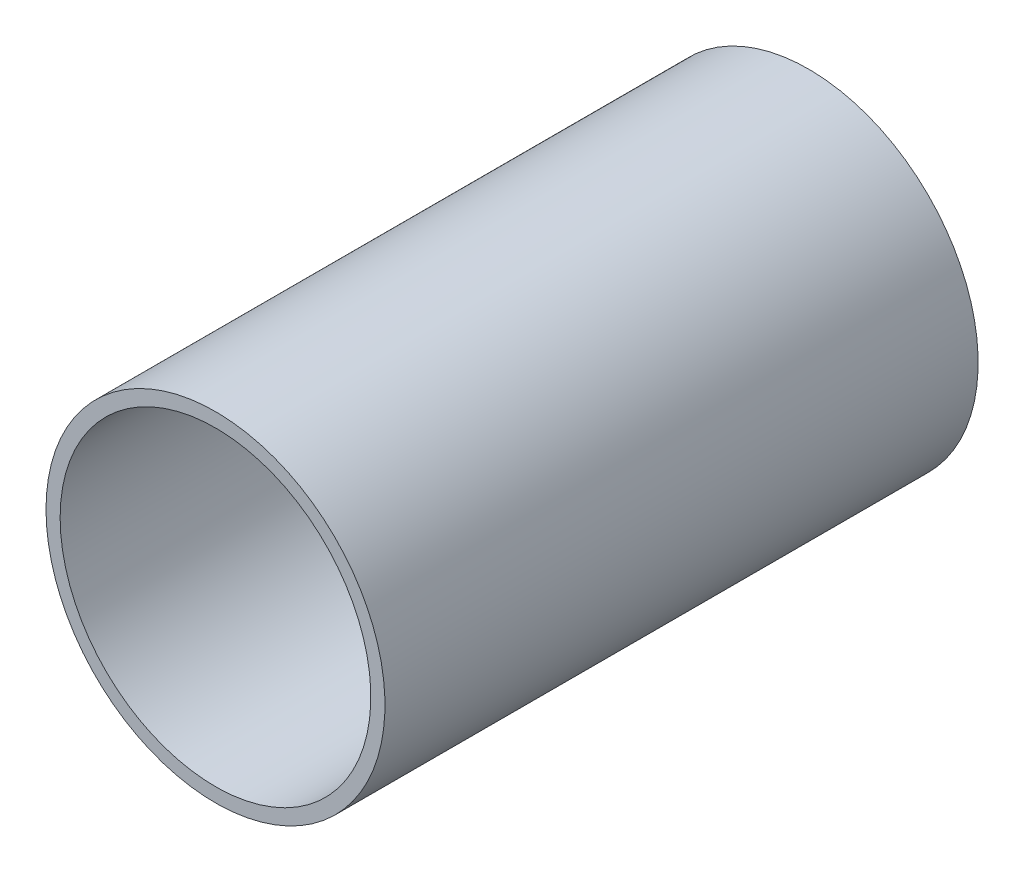
ISO-10303-21;
HEADER;
FILE_DESCRIPTION(('STEP AP214'),'2;1');
FILE_NAME('part.step','',(''),(''),'','','');
FILE_SCHEMA(('AUTOMOTIVE_DESIGN { 1 0 10303 214 1 1 1 1 }'));
ENDSEC;
DATA;
#1=APPLICATION_CONTEXT('core data for automotive mechanical design processes');
#2=APPLICATION_PROTOCOL_DEFINITION('international standard','automotive_design',2000,#1);
#3=PRODUCT_CONTEXT('',#1,'mechanical');
#4=PRODUCT('Part','Part','',(#3));
#5=PRODUCT_RELATED_PRODUCT_CATEGORY('part','',(#4));
#6=PRODUCT_DEFINITION_FORMATION('','',#4);
#7=PRODUCT_DEFINITION_CONTEXT('part definition',#1,'design');
#8=PRODUCT_DEFINITION('design','',#6,#7);
#9=PRODUCT_DEFINITION_SHAPE('','',#8);
#10=(LENGTH_UNIT() NAMED_UNIT(*) SI_UNIT(.MILLI.,.METRE.));
#11=(NAMED_UNIT(*) PLANE_ANGLE_UNIT() SI_UNIT($,.RADIAN.));
#12=(NAMED_UNIT(*) SI_UNIT($,.STERADIAN.) SOLID_ANGLE_UNIT());
#13=UNCERTAINTY_MEASURE_WITH_UNIT(LENGTH_MEASURE(1.E-05),#10,'distance_accuracy_value','');
#14=(GEOMETRIC_REPRESENTATION_CONTEXT(3) GLOBAL_UNCERTAINTY_ASSIGNED_CONTEXT((#13)) GLOBAL_UNIT_ASSIGNED_CONTEXT((#10,
#11,#12)) REPRESENTATION_CONTEXT('',''));
#15=CARTESIAN_POINT('',(0.,0.,0.));
#16=DIRECTION('',(0.,0.,1.));
#17=DIRECTION('',(1.,0.,0.));
#18=AXIS2_PLACEMENT_3D('',#15,#16,#17);
#19=CARTESIAN_POINT('',(0.,0.,21.));
#20=DIRECTION('',(0.,0.,1.));
#21=DIRECTION('',(1.,0.,0.));
#22=AXIS2_PLACEMENT_3D('',#19,#20,#21);
#23=PLANE('',#22);
#24=CARTESIAN_POINT('',(0.,0.,21.));
#25=DIRECTION('',(0.,0.,1.));
#26=DIRECTION('',(1.,0.,0.));
#27=AXIS2_PLACEMENT_3D('',#24,#25,#26);
#28=CIRCLE('',#27,12.);
#29=CARTESIAN_POINT('',(-12.,0.,21.));
#30=VERTEX_POINT('',#29);
#31=EDGE_CURVE('E10',#30,#30,#28,.T.);
#32=ORIENTED_EDGE('',*,*,#31,.T.);
#33=EDGE_LOOP('',(#32));
#34=FACE_BOUND('',#33,.T.);
#35=CARTESIAN_POINT('',(0.,0.,21.));
#36=DIRECTION('',(0.,0.,1.));
#37=DIRECTION('',(1.,0.,0.));
#38=AXIS2_PLACEMENT_3D('',#35,#36,#37);
#39=CIRCLE('',#38,11.);
#40=CARTESIAN_POINT('',(-11.,0.,21.));
#41=VERTEX_POINT('',#40);
#42=EDGE_CURVE('E42',#41,#41,#39,.T.);
#43=ORIENTED_EDGE('',*,*,#42,.F.);
#44=EDGE_LOOP('',(#43));
#45=FACE_BOUND('',#44,.T.);
#46=ADVANCED_FACE('F31',(#34,#45),#23,.T.);
#47=CARTESIAN_POINT('',(0.,0.,-21.));
#48=DIRECTION('',(0.,0.,1.));
#49=DIRECTION('',(1.,0.,0.));
#50=AXIS2_PLACEMENT_3D('',#47,#48,#49);
#51=PLANE('',#50);
#52=CARTESIAN_POINT('',(0.,0.,-21.));
#53=DIRECTION('',(0.,0.,1.));
#54=DIRECTION('',(1.,0.,0.));
#55=AXIS2_PLACEMENT_3D('',#52,#53,#54);
#56=CIRCLE('',#55,12.);
#57=CARTESIAN_POINT('',(-12.,0.,-21.));
#58=VERTEX_POINT('',#57);
#59=EDGE_CURVE('E35',#58,#58,#56,.T.);
#60=ORIENTED_EDGE('',*,*,#59,.F.);
#61=EDGE_LOOP('',(#60));
#62=FACE_BOUND('',#61,.T.);
#63=CARTESIAN_POINT('',(0.,0.,-21.));
#64=DIRECTION('',(0.,0.,1.));
#65=DIRECTION('',(1.,0.,0.));
#66=AXIS2_PLACEMENT_3D('',#63,#64,#65);
#67=CIRCLE('',#66,11.);
#68=CARTESIAN_POINT('',(-11.,0.,-21.));
#69=VERTEX_POINT('',#68);
#70=EDGE_CURVE('E44',#69,#69,#67,.T.);
#71=ORIENTED_EDGE('',*,*,#70,.T.);
#72=EDGE_LOOP('',(#71));
#73=FACE_BOUND('',#72,.T.);
#74=ADVANCED_FACE('F54',(#62,#73),#51,.F.);
#75=CARTESIAN_POINT('',(0.,0.,21.));
#76=DIRECTION('',(0.,0.,-1.));
#77=DIRECTION('',(-1.,0.,0.));
#78=AXIS2_PLACEMENT_3D('',#75,#76,#77);
#79=CYLINDRICAL_SURFACE('',#78,12.);
#80=CARTESIAN_POINT('',(-12.,0.,21.));
#81=CARTESIAN_POINT('',(-12.,0.,20.5625));
#82=CARTESIAN_POINT('',(-12.,0.,20.125));
#83=CARTESIAN_POINT('',(-12.,0.,19.25));
#84=CARTESIAN_POINT('',(-12.,0.,18.8125));
#85=CARTESIAN_POINT('',(-12.,0.,17.9375));
#86=CARTESIAN_POINT('',(-12.,0.,17.5));
#87=CARTESIAN_POINT('',(-12.,0.,16.625));
#88=CARTESIAN_POINT('',(-12.,0.,16.1875));
#89=CARTESIAN_POINT('',(-12.,0.,15.3125));
#90=CARTESIAN_POINT('',(-12.,0.,14.875));
#91=CARTESIAN_POINT('',(-12.,0.,14.));
#92=CARTESIAN_POINT('',(-12.,0.,13.5625));
#93=CARTESIAN_POINT('',(-12.,0.,12.6875));
#94=CARTESIAN_POINT('',(-12.,0.,12.25));
#95=CARTESIAN_POINT('',(-12.,0.,11.375));
#96=CARTESIAN_POINT('',(-12.,0.,10.9375));
#97=CARTESIAN_POINT('',(-12.,0.,10.0625));
#98=CARTESIAN_POINT('',(-12.,0.,9.625));
#99=CARTESIAN_POINT('',(-12.,0.,8.75));
#100=CARTESIAN_POINT('',(-12.,0.,8.3125));
#101=CARTESIAN_POINT('',(-12.,0.,7.4375));
#102=CARTESIAN_POINT('',(-12.,0.,7.));
#103=CARTESIAN_POINT('',(-12.,0.,6.125));
#104=CARTESIAN_POINT('',(-12.,0.,5.6875));
#105=CARTESIAN_POINT('',(-12.,0.,4.8125));
#106=CARTESIAN_POINT('',(-12.,0.,4.375));
#107=CARTESIAN_POINT('',(-12.,0.,3.5));
#108=CARTESIAN_POINT('',(-12.,0.,3.0625));
#109=CARTESIAN_POINT('',(-12.,0.,2.1875));
#110=CARTESIAN_POINT('',(-12.,0.,1.75));
#111=CARTESIAN_POINT('',(-12.,0.,0.874999999999997));
#112=CARTESIAN_POINT('',(-12.,0.,0.437499999999997));
#113=CARTESIAN_POINT('',(-12.,0.,-0.437500000000004));
#114=CARTESIAN_POINT('',(-12.,0.,-0.875000000000004));
#115=CARTESIAN_POINT('',(-12.,0.,-1.75000000000001));
#116=CARTESIAN_POINT('',(-12.,0.,-2.18750000000001));
#117=CARTESIAN_POINT('',(-12.,0.,-3.0625));
#118=CARTESIAN_POINT('',(-12.,0.,-3.5));
#119=CARTESIAN_POINT('',(-12.,0.,-4.375));
#120=CARTESIAN_POINT('',(-12.,0.,-4.8125));
#121=CARTESIAN_POINT('',(-12.,0.,-5.68750000000001));
#122=CARTESIAN_POINT('',(-12.,0.,-6.12500000000001));
#123=CARTESIAN_POINT('',(-12.,0.,-7.00000000000001));
#124=CARTESIAN_POINT('',(-12.,0.,-7.4375));
#125=CARTESIAN_POINT('',(-12.,0.,-8.3125));
#126=CARTESIAN_POINT('',(-12.,0.,-8.75));
#127=CARTESIAN_POINT('',(-12.,0.,-9.625));
#128=CARTESIAN_POINT('',(-12.,0.,-10.0625));
#129=CARTESIAN_POINT('',(-12.,0.,-10.9375));
#130=CARTESIAN_POINT('',(-12.,0.,-11.375));
#131=CARTESIAN_POINT('',(-12.,0.,-12.25));
#132=CARTESIAN_POINT('',(-12.,0.,-12.6875));
#133=CARTESIAN_POINT('',(-12.,0.,-13.5625));
#134=CARTESIAN_POINT('',(-12.,0.,-14.));
#135=CARTESIAN_POINT('',(-12.,0.,-14.875));
#136=CARTESIAN_POINT('',(-12.,0.,-15.3125));
#137=CARTESIAN_POINT('',(-12.,0.,-16.1875));
#138=CARTESIAN_POINT('',(-12.,0.,-16.625));
#139=CARTESIAN_POINT('',(-12.,0.,-17.5));
#140=CARTESIAN_POINT('',(-12.,0.,-17.9375));
#141=CARTESIAN_POINT('',(-12.,0.,-18.8125));
#142=CARTESIAN_POINT('',(-12.,0.,-19.25));
#143=CARTESIAN_POINT('',(-12.,0.,-20.125));
#144=CARTESIAN_POINT('',(-12.,0.,-20.5625));
#145=CARTESIAN_POINT('',(-12.,0.,-21.));
#146=B_SPLINE_CURVE_WITH_KNOTS('',3,(#80,#81,#82,#83,#84,#85,#86,#87,#88,#89,#90,#91,#92,#93,
#94,#95,#96,#97,#98,#99,#100,#101,#102,#103,#104,#105,#106,#107,#108,#109,#110,#111,#112,#113,
#114,#115,#116,#117,#118,#119,#120,#121,#122,#123,#124,#125,#126,#127,#128,#129,#130,#131,#132,
#133,#134,#135,#136,#137,#138,#139,#140,#141,#142,#143,#144,#145),.UNSPECIFIED.,.F.,.F.,(4,2,2,
2,2,2,2,2,2,2,2,2,2,2,2,2,2,2,2,2,2,2,2,2,2,2,2,2,2,2,2,2,4),(0.,1.3125,2.625,3.9375,5.25,
6.5625,7.875,9.1875,10.5,11.8125,13.125,14.4375,15.75,17.0625,18.375,19.6875,21.,22.3125,23.625,
24.9375,26.25,27.5625,28.875,30.1875,31.5,32.8125,34.125,35.4375,36.75,38.0625,39.375,40.6875,
42.),.UNSPECIFIED.);
#147=EDGE_CURVE('BSEAM33',#30,#58,#146,.T.);
#148=ORIENTED_EDGE('',*,*,#31,.F.);
#149=ORIENTED_EDGE('',*,*,#59,.T.);
#150=ORIENTED_EDGE('',*,*,#147,.T.);
#151=ORIENTED_EDGE('',*,*,#147,.F.);
#152=EDGE_LOOP('',(#148,#150,#149,#151));
#153=FACE_BOUND('',#152,.T.);
#154=ADVANCED_FACE('F33',(#153),#79,.T.);
#155=CARTESIAN_POINT('',(0.,0.,21.));
#156=DIRECTION('',(0.,0.,-1.));
#157=DIRECTION('',(-1.,0.,0.));
#158=AXIS2_PLACEMENT_3D('',#155,#156,#157);
#159=CYLINDRICAL_SURFACE('',#158,11.);
#160=CARTESIAN_POINT('',(-11.,0.,21.));
#161=CARTESIAN_POINT('',(-11.,0.,20.5625));
#162=CARTESIAN_POINT('',(-11.,0.,20.125));
#163=CARTESIAN_POINT('',(-11.,0.,19.25));
#164=CARTESIAN_POINT('',(-11.,0.,18.8125));
#165=CARTESIAN_POINT('',(-11.,0.,17.9375));
#166=CARTESIAN_POINT('',(-11.,0.,17.5));
#167=CARTESIAN_POINT('',(-11.,0.,16.625));
#168=CARTESIAN_POINT('',(-11.,0.,16.1875));
#169=CARTESIAN_POINT('',(-11.,0.,15.3125));
#170=CARTESIAN_POINT('',(-11.,0.,14.875));
#171=CARTESIAN_POINT('',(-11.,0.,14.));
#172=CARTESIAN_POINT('',(-11.,0.,13.5625));
#173=CARTESIAN_POINT('',(-11.,0.,12.6875));
#174=CARTESIAN_POINT('',(-11.,0.,12.25));
#175=CARTESIAN_POINT('',(-11.,0.,11.375));
#176=CARTESIAN_POINT('',(-11.,0.,10.9375));
#177=CARTESIAN_POINT('',(-11.,0.,10.0625));
#178=CARTESIAN_POINT('',(-11.,0.,9.625));
#179=CARTESIAN_POINT('',(-11.,0.,8.75));
#180=CARTESIAN_POINT('',(-11.,0.,8.3125));
#181=CARTESIAN_POINT('',(-11.,0.,7.4375));
#182=CARTESIAN_POINT('',(-11.,0.,7.));
#183=CARTESIAN_POINT('',(-11.,0.,6.125));
#184=CARTESIAN_POINT('',(-11.,0.,5.6875));
#185=CARTESIAN_POINT('',(-11.,0.,4.8125));
#186=CARTESIAN_POINT('',(-11.,0.,4.375));
#187=CARTESIAN_POINT('',(-11.,0.,3.5));
#188=CARTESIAN_POINT('',(-11.,0.,3.0625));
#189=CARTESIAN_POINT('',(-11.,0.,2.1875));
#190=CARTESIAN_POINT('',(-11.,0.,1.75));
#191=CARTESIAN_POINT('',(-11.,0.,0.875000000000001));
#192=CARTESIAN_POINT('',(-11.,0.,0.4375));
#193=CARTESIAN_POINT('',(-11.,0.,-0.4375));
#194=CARTESIAN_POINT('',(-11.,0.,-0.875000000000001));
#195=CARTESIAN_POINT('',(-11.,0.,-1.75));
#196=CARTESIAN_POINT('',(-11.,0.,-2.1875));
#197=CARTESIAN_POINT('',(-11.,0.,-3.0625));
#198=CARTESIAN_POINT('',(-11.,0.,-3.5));
#199=CARTESIAN_POINT('',(-11.,0.,-4.375));
#200=CARTESIAN_POINT('',(-11.,0.,-4.8125));
#201=CARTESIAN_POINT('',(-11.,0.,-5.6875));
#202=CARTESIAN_POINT('',(-11.,0.,-6.125));
#203=CARTESIAN_POINT('',(-11.,0.,-7.));
#204=CARTESIAN_POINT('',(-11.,0.,-7.4375));
#205=CARTESIAN_POINT('',(-11.,0.,-8.3125));
#206=CARTESIAN_POINT('',(-11.,0.,-8.75));
#207=CARTESIAN_POINT('',(-11.,0.,-9.625));
#208=CARTESIAN_POINT('',(-11.,0.,-10.0625));
#209=CARTESIAN_POINT('',(-11.,0.,-10.9375));
#210=CARTESIAN_POINT('',(-11.,0.,-11.375));
#211=CARTESIAN_POINT('',(-11.,0.,-12.25));
#212=CARTESIAN_POINT('',(-11.,0.,-12.6875));
#213=CARTESIAN_POINT('',(-11.,0.,-13.5625));
#214=CARTESIAN_POINT('',(-11.,0.,-14.));
#215=CARTESIAN_POINT('',(-11.,0.,-14.875));
#216=CARTESIAN_POINT('',(-11.,0.,-15.3125));
#217=CARTESIAN_POINT('',(-11.,0.,-16.1875));
#218=CARTESIAN_POINT('',(-11.,0.,-16.625));
#219=CARTESIAN_POINT('',(-11.,0.,-17.5));
#220=CARTESIAN_POINT('',(-11.,0.,-17.9375));
#221=CARTESIAN_POINT('',(-11.,0.,-18.8125));
#222=CARTESIAN_POINT('',(-11.,0.,-19.25));
#223=CARTESIAN_POINT('',(-11.,0.,-20.125));
#224=CARTESIAN_POINT('',(-11.,0.,-20.5625));
#225=CARTESIAN_POINT('',(-11.,0.,-21.));
#226=B_SPLINE_CURVE_WITH_KNOTS('',3,(#160,#161,#162,#163,#164,#165,#166,#167,#168,#169,#170,
#171,#172,#173,#174,#175,#176,#177,#178,#179,#180,#181,#182,#183,#184,#185,#186,#187,#188,#189,
#190,#191,#192,#193,#194,#195,#196,#197,#198,#199,#200,#201,#202,#203,#204,#205,#206,#207,#208,
#209,#210,#211,#212,#213,#214,#215,#216,#217,#218,#219,#220,#221,#222,#223,#224,#225),
.UNSPECIFIED.,.F.,.F.,(4,2,2,2,2,2,2,2,2,2,2,2,2,2,2,2,2,2,2,2,2,2,2,2,2,2,2,2,2,2,2,2,4),(0.,
1.3125,2.625,3.9375,5.25,6.5625,7.875,9.1875,10.5,11.8125,13.125,14.4375,15.75,17.0625,18.375,
19.6875,21.,22.3125,23.625,24.9375,26.25,27.5625,28.875,30.1875,31.5,32.8125,34.125,35.4375,
36.75,38.0625,39.375,40.6875,42.),.UNSPECIFIED.);
#227=EDGE_CURVE('BSEAM50',#41,#69,#226,.T.);
#228=ORIENTED_EDGE('',*,*,#42,.T.);
#229=ORIENTED_EDGE('',*,*,#70,.F.);
#230=ORIENTED_EDGE('',*,*,#227,.T.);
#231=ORIENTED_EDGE('',*,*,#227,.F.);
#232=EDGE_LOOP('',(#228,#230,#229,#231));
#233=FACE_BOUND('',#232,.T.);
#234=ADVANCED_FACE('F50',(#233),#159,.F.);
#235=CLOSED_SHELL('',(#46,#74,#154,#234));
#236=MANIFOLD_SOLID_BREP('B2',#235);
#237=ADVANCED_BREP_SHAPE_REPRESENTATION('',(#18,#236),#14);
#238=SHAPE_DEFINITION_REPRESENTATION(#9,#237);
ENDSEC;
END-ISO-10303-21;
